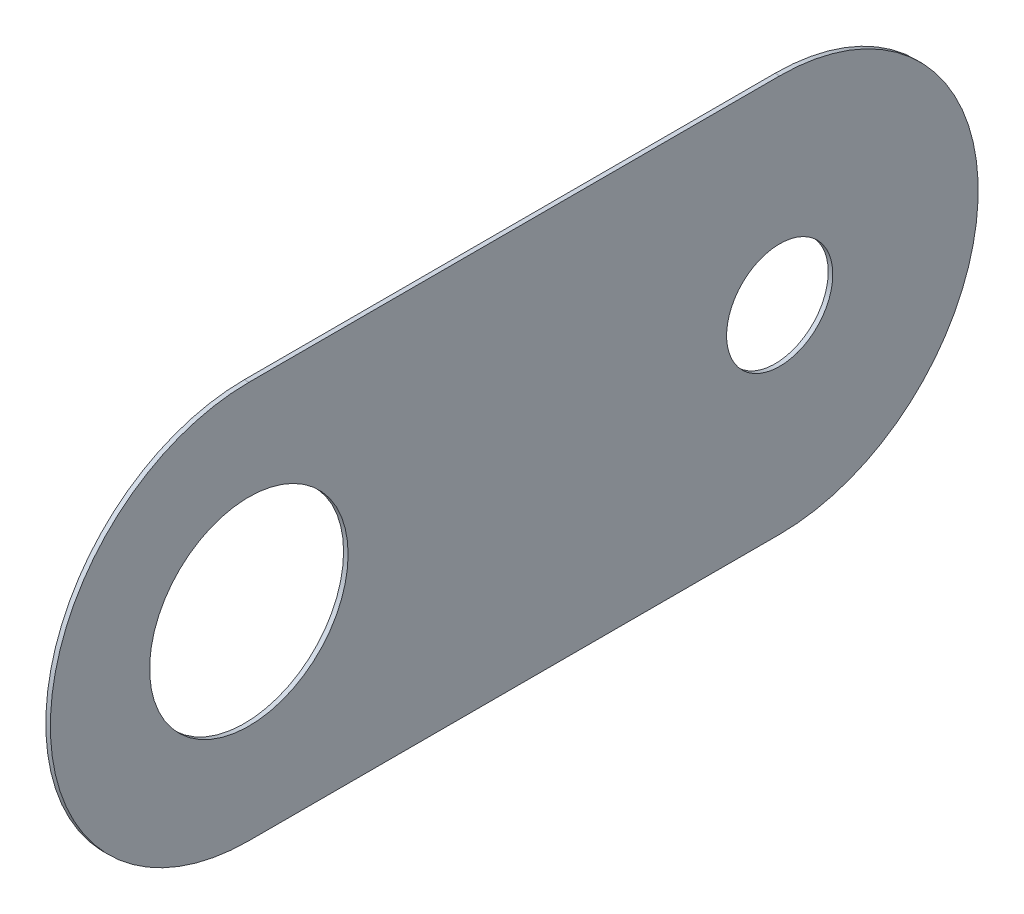
ISO-10303-21;
HEADER;
FILE_DESCRIPTION(('STEP AP214'),'2;1');
FILE_NAME('part.step','',(''),(''),'','','');
FILE_SCHEMA(('AUTOMOTIVE_DESIGN { 1 0 10303 214 1 1 1 1 }'));
ENDSEC;
DATA;
#1=APPLICATION_CONTEXT('core data for automotive mechanical design processes');
#2=APPLICATION_PROTOCOL_DEFINITION('international standard','automotive_design',2000,#1);
#3=PRODUCT_CONTEXT('',#1,'mechanical');
#4=PRODUCT('Part','Part','',(#3));
#5=PRODUCT_RELATED_PRODUCT_CATEGORY('part','',(#4));
#6=PRODUCT_DEFINITION_FORMATION('','',#4);
#7=PRODUCT_DEFINITION_CONTEXT('part definition',#1,'design');
#8=PRODUCT_DEFINITION('design','',#6,#7);
#9=PRODUCT_DEFINITION_SHAPE('','',#8);
#10=(LENGTH_UNIT() NAMED_UNIT(*) SI_UNIT(.MILLI.,.METRE.));
#11=(NAMED_UNIT(*) PLANE_ANGLE_UNIT() SI_UNIT($,.RADIAN.));
#12=(NAMED_UNIT(*) SI_UNIT($,.STERADIAN.) SOLID_ANGLE_UNIT());
#13=UNCERTAINTY_MEASURE_WITH_UNIT(LENGTH_MEASURE(1.E-05),#10,'distance_accuracy_value','');
#14=(GEOMETRIC_REPRESENTATION_CONTEXT(3) GLOBAL_UNCERTAINTY_ASSIGNED_CONTEXT((#13)) GLOBAL_UNIT_ASSIGNED_CONTEXT((#10,
#11,#12)) REPRESENTATION_CONTEXT('',''));
#15=CARTESIAN_POINT('',(0.,0.,0.));
#16=DIRECTION('',(0.,0.,1.));
#17=DIRECTION('',(1.,0.,0.));
#18=AXIS2_PLACEMENT_3D('',#15,#16,#17);
#19=CARTESIAN_POINT('',(1.08712,47.498,0.));
#20=DIRECTION('',(1.,0.,0.));
#21=DIRECTION('',(0.,0.,-1.));
#22=AXIS2_PLACEMENT_3D('',#19,#20,#21);
#23=PLANE('',#22);
#24=CARTESIAN_POINT('',(1.08712,47.498,0.));
#25=DIRECTION('',(1.,0.,0.));
#26=DIRECTION('',(0.,0.,-1.));
#27=AXIS2_PLACEMENT_3D('',#24,#25,#26);
#28=CIRCLE('',#27,12.7);
#29=CARTESIAN_POINT('',(1.08712,47.498,-12.7));
#30=VERTEX_POINT('',#29);
#31=EDGE_CURVE('E124',#30,#30,#28,.T.);
#32=ORIENTED_EDGE('',*,*,#31,.F.);
#33=EDGE_LOOP('',(#32));
#34=FACE_BOUND('',#33,.T.);
#35=CARTESIAN_POINT('',(1.08712,47.498,0.));
#36=DIRECTION('',(1.,0.,0.));
#37=DIRECTION('',(0.,0.,-1.));
#38=AXIS2_PLACEMENT_3D('',#35,#36,#37);
#39=CIRCLE('',#38,47.498);
#40=CARTESIAN_POINT('',(1.08712,0.,0.));
#41=VERTEX_POINT('',#40);
#42=CARTESIAN_POINT('',(1.08712,94.996,0.));
#43=VERTEX_POINT('',#42);
#44=EDGE_CURVE('E101',#41,#43,#39,.T.);
#45=ORIENTED_EDGE('',*,*,#44,.T.);
#46=DIRECTION('',(0.,0.,1.));
#47=VECTOR('',#46,1.);
#48=CARTESIAN_POINT('',(1.08712,94.996,0.));
#49=LINE('',#48,#47);
#50=CARTESIAN_POINT('',(1.08712,94.996,127.));
#51=VERTEX_POINT('',#50);
#52=EDGE_CURVE('E98',#43,#51,#49,.T.);
#53=ORIENTED_EDGE('',*,*,#52,.T.);
#54=CARTESIAN_POINT('',(1.08712,47.498,127.));
#55=DIRECTION('',(1.,0.,0.));
#56=DIRECTION('',(0.,0.,1.));
#57=AXIS2_PLACEMENT_3D('',#54,#55,#56);
#58=CIRCLE('',#57,47.498);
#59=CARTESIAN_POINT('',(1.08712,0.,127.));
#60=VERTEX_POINT('',#59);
#61=EDGE_CURVE('E105',#51,#60,#58,.T.);
#62=ORIENTED_EDGE('',*,*,#61,.T.);
#63=DIRECTION('',(0.,0.,-1.));
#64=VECTOR('',#63,1.);
#65=CARTESIAN_POINT('',(1.08712,0.,0.));
#66=LINE('',#65,#64);
#67=EDGE_CURVE('E69',#60,#41,#66,.T.);
#68=ORIENTED_EDGE('',*,*,#67,.T.);
#69=EDGE_LOOP('',(#45,#53,#62,#68));
#70=FACE_BOUND('',#69,.T.);
#71=CARTESIAN_POINT('',(1.08712,47.498,127.));
#72=DIRECTION('',(1.,0.,0.));
#73=DIRECTION('',(0.,0.,-1.));
#74=AXIS2_PLACEMENT_3D('',#71,#72,#73);
#75=CIRCLE('',#74,23.749);
#76=CARTESIAN_POINT('',(1.08712,47.498,103.251));
#77=VERTEX_POINT('',#76);
#78=EDGE_CURVE('E146',#77,#77,#75,.T.);
#79=ORIENTED_EDGE('',*,*,#78,.F.);
#80=EDGE_LOOP('',(#79));
#81=FACE_BOUND('',#80,.T.);
#82=ADVANCED_FACE('F51',(#34,#70,#81),#23,.T.);
#83=CARTESIAN_POINT('',(0.,47.498,0.));
#84=DIRECTION('',(1.,0.,0.));
#85=DIRECTION('',(0.,0.,-1.));
#86=AXIS2_PLACEMENT_3D('',#83,#84,#85);
#87=PLANE('',#86);
#88=CARTESIAN_POINT('',(0.,47.498,0.));
#89=DIRECTION('',(1.,0.,0.));
#90=DIRECTION('',(0.,0.,-1.));
#91=AXIS2_PLACEMENT_3D('',#88,#89,#90);
#92=CIRCLE('',#91,47.498);
#93=CARTESIAN_POINT('',(0.,0.,0.));
#94=VERTEX_POINT('',#93);
#95=CARTESIAN_POINT('',(0.,94.996,0.));
#96=VERTEX_POINT('',#95);
#97=EDGE_CURVE('E123',#94,#96,#92,.T.);
#98=ORIENTED_EDGE('',*,*,#97,.F.);
#99=DIRECTION('',(0.,0.,-1.));
#100=VECTOR('',#99,1.);
#101=CARTESIAN_POINT('',(0.,0.,0.));
#102=LINE('',#101,#100);
#103=CARTESIAN_POINT('',(0.,0.,127.));
#104=VERTEX_POINT('',#103);
#105=EDGE_CURVE('E95',#104,#94,#102,.T.);
#106=ORIENTED_EDGE('',*,*,#105,.F.);
#107=CARTESIAN_POINT('',(0.,47.498,127.));
#108=DIRECTION('',(1.,0.,0.));
#109=DIRECTION('',(0.,0.,1.));
#110=AXIS2_PLACEMENT_3D('',#107,#108,#109);
#111=CIRCLE('',#110,47.498);
#112=CARTESIAN_POINT('',(0.,94.996,127.));
#113=VERTEX_POINT('',#112);
#114=EDGE_CURVE('E86',#113,#104,#111,.T.);
#115=ORIENTED_EDGE('',*,*,#114,.F.);
#116=DIRECTION('',(0.,0.,1.));
#117=VECTOR('',#116,1.);
#118=CARTESIAN_POINT('',(0.,94.996,0.));
#119=LINE('',#118,#117);
#120=EDGE_CURVE('E106',#96,#113,#119,.T.);
#121=ORIENTED_EDGE('',*,*,#120,.F.);
#122=EDGE_LOOP('',(#98,#106,#115,#121));
#123=FACE_BOUND('',#122,.T.);
#124=CARTESIAN_POINT('',(0.,47.498,0.));
#125=DIRECTION('',(1.,0.,0.));
#126=DIRECTION('',(0.,0.,-1.));
#127=AXIS2_PLACEMENT_3D('',#124,#125,#126);
#128=CIRCLE('',#127,12.7);
#129=CARTESIAN_POINT('',(0.,47.498,-12.7));
#130=VERTEX_POINT('',#129);
#131=EDGE_CURVE('E144',#130,#130,#128,.T.);
#132=ORIENTED_EDGE('',*,*,#131,.T.);
#133=EDGE_LOOP('',(#132));
#134=FACE_BOUND('',#133,.T.);
#135=CARTESIAN_POINT('',(0.,47.498,127.));
#136=DIRECTION('',(1.,0.,0.));
#137=DIRECTION('',(0.,0.,-1.));
#138=AXIS2_PLACEMENT_3D('',#135,#136,#137);
#139=CIRCLE('',#138,23.749);
#140=CARTESIAN_POINT('',(0.,47.498,103.251));
#141=VERTEX_POINT('',#140);
#142=EDGE_CURVE('E155',#141,#141,#139,.T.);
#143=ORIENTED_EDGE('',*,*,#142,.T.);
#144=EDGE_LOOP('',(#143));
#145=FACE_BOUND('',#144,.T.);
#146=ADVANCED_FACE('F137',(#123,#134,#145),#87,.F.);
#147=CARTESIAN_POINT('',(1.08712,47.498,0.));
#148=DIRECTION('',(-1.,0.,0.));
#149=DIRECTION('',(0.,0.,1.));
#150=AXIS2_PLACEMENT_3D('',#147,#148,#149);
#151=CYLINDRICAL_SURFACE('',#150,47.498);
#152=ORIENTED_EDGE('',*,*,#97,.T.);
#153=DIRECTION('',(-1.,0.,0.));
#154=VECTOR('',#153,1.);
#155=CARTESIAN_POINT('',(1.08712,94.996,0.));
#156=LINE('',#155,#154);
#157=EDGE_CURVE('E13',#43,#96,#156,.T.);
#158=ORIENTED_EDGE('',*,*,#157,.F.);
#159=ORIENTED_EDGE('',*,*,#44,.F.);
#160=DIRECTION('',(-1.,0.,0.));
#161=VECTOR('',#160,1.);
#162=CARTESIAN_POINT('',(1.08712,0.,0.));
#163=LINE('',#162,#161);
#164=EDGE_CURVE('E119',#41,#94,#163,.T.);
#165=ORIENTED_EDGE('',*,*,#164,.T.);
#166=EDGE_LOOP('',(#152,#158,#159,#165));
#167=FACE_BOUND('',#166,.T.);
#168=ADVANCED_FACE('F52',(#167),#151,.T.);
#169=CARTESIAN_POINT('',(1.08712,94.996,0.));
#170=DIRECTION('',(0.,-1.,0.));
#171=DIRECTION('',(0.,0.,-1.));
#172=AXIS2_PLACEMENT_3D('',#169,#170,#171);
#173=PLANE('',#172);
#174=ORIENTED_EDGE('',*,*,#120,.T.);
#175=DIRECTION('',(-1.,0.,0.));
#176=VECTOR('',#175,1.);
#177=CARTESIAN_POINT('',(1.08712,94.996,127.));
#178=LINE('',#177,#176);
#179=EDGE_CURVE('E62',#51,#113,#178,.T.);
#180=ORIENTED_EDGE('',*,*,#179,.F.);
#181=ORIENTED_EDGE('',*,*,#52,.F.);
#182=ORIENTED_EDGE('',*,*,#157,.T.);
#183=EDGE_LOOP('',(#174,#180,#181,#182));
#184=FACE_BOUND('',#183,.T.);
#185=ADVANCED_FACE('F110',(#184),#173,.F.);
#186=CARTESIAN_POINT('',(1.08712,47.498,127.));
#187=DIRECTION('',(-1.,0.,0.));
#188=DIRECTION('',(0.,0.,1.));
#189=AXIS2_PLACEMENT_3D('',#186,#187,#188);
#190=CYLINDRICAL_SURFACE('',#189,47.498);
#191=ORIENTED_EDGE('',*,*,#114,.T.);
#192=DIRECTION('',(-1.,0.,0.));
#193=VECTOR('',#192,1.);
#194=CARTESIAN_POINT('',(1.08712,0.,127.));
#195=LINE('',#194,#193);
#196=EDGE_CURVE('E112',#60,#104,#195,.T.);
#197=ORIENTED_EDGE('',*,*,#196,.F.);
#198=ORIENTED_EDGE('',*,*,#61,.F.);
#199=ORIENTED_EDGE('',*,*,#179,.T.);
#200=EDGE_LOOP('',(#191,#197,#198,#199));
#201=FACE_BOUND('',#200,.T.);
#202=ADVANCED_FACE('F115',(#201),#190,.T.);
#203=CARTESIAN_POINT('',(1.08712,0.,0.));
#204=DIRECTION('',(0.,1.,0.));
#205=DIRECTION('',(0.,0.,1.));
#206=AXIS2_PLACEMENT_3D('',#203,#204,#205);
#207=PLANE('',#206);
#208=ORIENTED_EDGE('',*,*,#105,.T.);
#209=ORIENTED_EDGE('',*,*,#164,.F.);
#210=ORIENTED_EDGE('',*,*,#67,.F.);
#211=ORIENTED_EDGE('',*,*,#196,.T.);
#212=EDGE_LOOP('',(#208,#209,#210,#211));
#213=FACE_BOUND('',#212,.T.);
#214=ADVANCED_FACE('F136',(#213),#207,.F.);
#215=CARTESIAN_POINT('',(1.08712,47.498,0.));
#216=DIRECTION('',(-1.,0.,0.));
#217=DIRECTION('',(0.,0.,1.));
#218=AXIS2_PLACEMENT_3D('',#215,#216,#217);
#219=CYLINDRICAL_SURFACE('',#218,12.7);
#220=ORIENTED_EDGE('',*,*,#31,.T.);
#221=EDGE_LOOP('',(#220));
#222=FACE_BOUND('',#221,.T.);
#223=ORIENTED_EDGE('',*,*,#131,.F.);
#224=EDGE_LOOP('',(#223));
#225=FACE_BOUND('',#224,.T.);
#226=ADVANCED_FACE('F171',(#222,#225),#219,.F.);
#227=CARTESIAN_POINT('',(1.08712,47.498,127.));
#228=DIRECTION('',(-1.,0.,0.));
#229=DIRECTION('',(0.,0.,1.));
#230=AXIS2_PLACEMENT_3D('',#227,#228,#229);
#231=CYLINDRICAL_SURFACE('',#230,23.749);
#232=ORIENTED_EDGE('',*,*,#78,.T.);
#233=EDGE_LOOP('',(#232));
#234=FACE_BOUND('',#233,.T.);
#235=ORIENTED_EDGE('',*,*,#142,.F.);
#236=EDGE_LOOP('',(#235));
#237=FACE_BOUND('',#236,.T.);
#238=ADVANCED_FACE('F164',(#234,#237),#231,.F.);
#239=CLOSED_SHELL('',(#82,#146,#168,#185,#202,#214,#226,#238));
#240=MANIFOLD_SOLID_BREP('B2',#239);
#241=ADVANCED_BREP_SHAPE_REPRESENTATION('',(#18,#240),#14);
#242=SHAPE_DEFINITION_REPRESENTATION(#9,#241);
ENDSEC;
END-ISO-10303-21;
